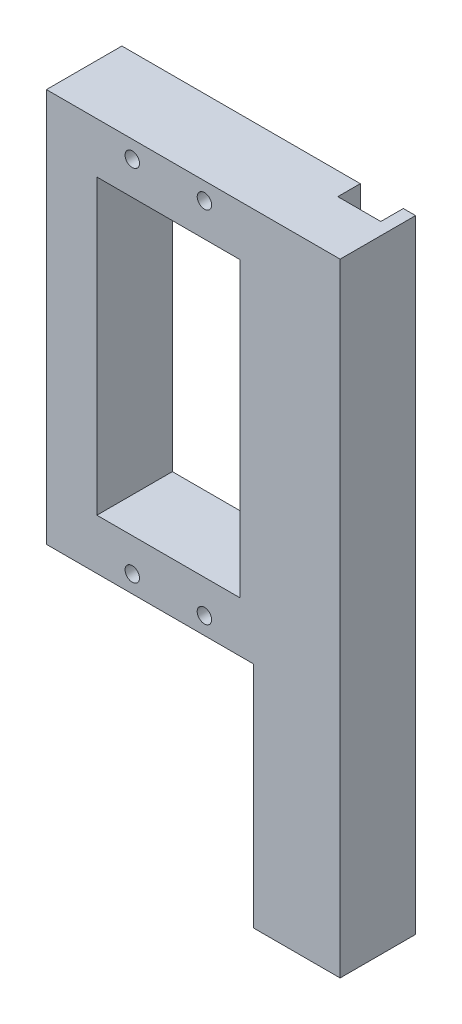
ISO-10303-21;
HEADER;
FILE_DESCRIPTION(('STEP AP214'),'2;1');
FILE_NAME('part.step','',(''),(''),'','','');
FILE_SCHEMA(('AUTOMOTIVE_DESIGN { 1 0 10303 214 1 1 1 1 }'));
ENDSEC;
DATA;
#1=APPLICATION_CONTEXT('core data for automotive mechanical design processes');
#2=APPLICATION_PROTOCOL_DEFINITION('international standard','automotive_design',2000,#1);
#3=PRODUCT_CONTEXT('',#1,'mechanical');
#4=PRODUCT('Part','Part','',(#3));
#5=PRODUCT_RELATED_PRODUCT_CATEGORY('part','',(#4));
#6=PRODUCT_DEFINITION_FORMATION('','',#4);
#7=PRODUCT_DEFINITION_CONTEXT('part definition',#1,'design');
#8=PRODUCT_DEFINITION('design','',#6,#7);
#9=PRODUCT_DEFINITION_SHAPE('','',#8);
#10=(LENGTH_UNIT() NAMED_UNIT(*) SI_UNIT(.MILLI.,.METRE.));
#11=(NAMED_UNIT(*) PLANE_ANGLE_UNIT() SI_UNIT($,.RADIAN.));
#12=(NAMED_UNIT(*) SI_UNIT($,.STERADIAN.) SOLID_ANGLE_UNIT());
#13=UNCERTAINTY_MEASURE_WITH_UNIT(LENGTH_MEASURE(1.E-05),#10,'distance_accuracy_value','');
#14=(GEOMETRIC_REPRESENTATION_CONTEXT(3) GLOBAL_UNCERTAINTY_ASSIGNED_CONTEXT((#13)) GLOBAL_UNIT_ASSIGNED_CONTEXT((#10,
#11,#12)) REPRESENTATION_CONTEXT('',''));
#15=CARTESIAN_POINT('',(0.,0.,0.));
#16=DIRECTION('',(0.,0.,1.));
#17=DIRECTION('',(1.,0.,0.));
#18=AXIS2_PLACEMENT_3D('',#15,#16,#17);
#19=CARTESIAN_POINT('',(0.,0.,-30.46));
#20=DIRECTION('',(0.,0.,-1.));
#21=DIRECTION('',(1.,0.,0.));
#22=AXIS2_PLACEMENT_3D('',#19,#20,#21);
#23=PLANE('',#22);
#24=CARTESIAN_POINT('',(5.,-24.9,-30.46));
#25=DIRECTION('',(0.,0.,1.));
#26=DIRECTION('',(1.,0.,0.));
#27=AXIS2_PLACEMENT_3D('',#24,#25,#26);
#28=CIRCLE('',#27,1.);
#29=CARTESIAN_POINT('',(6.,-24.9,-30.46));
#30=VERTEX_POINT('',#29);
#31=EDGE_CURVE('E253',#30,#30,#28,.T.);
#32=ORIENTED_EDGE('',*,*,#31,.T.);
#33=EDGE_LOOP('',(#32));
#34=FACE_BOUND('',#33,.T.);
#35=CARTESIAN_POINT('',(-5.,24.89,-30.46));
#36=DIRECTION('',(0.,0.,1.));
#37=DIRECTION('',(1.,0.,0.));
#38=AXIS2_PLACEMENT_3D('',#35,#36,#37);
#39=CIRCLE('',#38,1.);
#40=CARTESIAN_POINT('',(-4.,24.89,-30.46));
#41=VERTEX_POINT('',#40);
#42=EDGE_CURVE('E489',#41,#41,#39,.T.);
#43=ORIENTED_EDGE('',*,*,#42,.T.);
#44=EDGE_LOOP('',(#43));
#45=FACE_BOUND('',#44,.T.);
#46=CARTESIAN_POINT('',(5.,24.89,-30.46));
#47=DIRECTION('',(0.,0.,1.));
#48=DIRECTION('',(1.,0.,0.));
#49=AXIS2_PLACEMENT_3D('',#46,#47,#48);
#50=CIRCLE('',#49,1.);
#51=CARTESIAN_POINT('',(6.,24.89,-30.46));
#52=VERTEX_POINT('',#51);
#53=EDGE_CURVE('E492',#52,#52,#50,.T.);
#54=ORIENTED_EDGE('',*,*,#53,.T.);
#55=EDGE_LOOP('',(#54));
#56=FACE_BOUND('',#55,.T.);
#57=CARTESIAN_POINT('',(-5.,-24.9,-30.46));
#58=DIRECTION('',(0.,0.,1.));
#59=DIRECTION('',(1.,0.,0.));
#60=AXIS2_PLACEMENT_3D('',#57,#58,#59);
#61=CIRCLE('',#60,1.);
#62=CARTESIAN_POINT('',(-4.,-24.9,-30.46));
#63=VERTEX_POINT('',#62);
#64=EDGE_CURVE('E162',#63,#63,#61,.T.);
#65=ORIENTED_EDGE('',*,*,#64,.T.);
#66=EDGE_LOOP('',(#65));
#67=FACE_BOUND('',#66,.T.);
#68=DIRECTION('',(0.,-1.,0.));
#69=VECTOR('',#68,1.);
#70=CARTESIAN_POINT('',(16.1509101807035,27.3,-30.46));
#71=LINE('',#70,#69);
#72=CARTESIAN_POINT('',(16.1509101807035,27.3,-30.46));
#73=VERTEX_POINT('',#72);
#74=CARTESIAN_POINT('',(16.1509101807035,-59.0021499848978,-30.46));
#75=VERTEX_POINT('',#74);
#76=EDGE_CURVE('E159',#73,#75,#71,.T.);
#77=ORIENTED_EDGE('',*,*,#76,.T.);
#78=DIRECTION('',(1.,0.,0.));
#79=VECTOR('',#78,1.);
#80=CARTESIAN_POINT('',(11.8131026191315,-59.0021499848978,-30.46));
#81=LINE('',#80,#79);
#82=CARTESIAN_POINT('',(11.8131026191315,-59.0021499848978,-30.46));
#83=VERTEX_POINT('',#82);
#84=EDGE_CURVE('E151',#83,#75,#81,.T.);
#85=ORIENTED_EDGE('',*,*,#84,.F.);
#86=DIRECTION('',(0.,-1.,0.));
#87=VECTOR('',#86,1.);
#88=CARTESIAN_POINT('',(11.8131026191315,-27.3,-30.46));
#89=LINE('',#88,#87);
#90=CARTESIAN_POINT('',(11.8131026191315,-27.3,-30.46));
#91=VERTEX_POINT('',#90);
#92=EDGE_CURVE('E214',#91,#83,#89,.T.);
#93=ORIENTED_EDGE('',*,*,#92,.F.);
#94=DIRECTION('',(1.,0.,0.));
#95=VECTOR('',#94,1.);
#96=CARTESIAN_POINT('',(-2.175,-27.3,-30.46));
#97=LINE('',#96,#95);
#98=CARTESIAN_POINT('',(-16.9,-27.3,-30.46));
#99=VERTEX_POINT('',#98);
#100=EDGE_CURVE('E211',#99,#91,#97,.T.);
#101=ORIENTED_EDGE('',*,*,#100,.F.);
#102=DIRECTION('',(0.,-1.,0.));
#103=VECTOR('',#102,1.);
#104=CARTESIAN_POINT('',(-16.9,27.3,-30.46));
#105=LINE('',#104,#103);
#106=CARTESIAN_POINT('',(-16.9,27.3,-30.46));
#107=VERTEX_POINT('',#106);
#108=EDGE_CURVE('E207',#107,#99,#105,.T.);
#109=ORIENTED_EDGE('',*,*,#108,.F.);
#110=DIRECTION('',(-1.,0.,0.));
#111=VECTOR('',#110,1.);
#112=CARTESIAN_POINT('',(-7.90000000000001,27.3,-30.46));
#113=LINE('',#112,#111);
#114=EDGE_CURVE('E208',#73,#107,#113,.T.);
#115=ORIENTED_EDGE('',*,*,#114,.F.);
#116=EDGE_LOOP('',(#77,#85,#93,#101,#109,#115));
#117=FACE_BOUND('',#116,.T.);
#118=DIRECTION('',(1.,0.,0.));
#119=VECTOR('',#118,1.);
#120=CARTESIAN_POINT('',(-9.9,-20.3,-30.46));
#121=LINE('',#120,#119);
#122=CARTESIAN_POINT('',(-9.9,-20.3,-30.46));
#123=VERTEX_POINT('',#122);
#124=CARTESIAN_POINT('',(9.9,-20.3,-30.46));
#125=VERTEX_POINT('',#124);
#126=EDGE_CURVE('E177',#123,#125,#121,.T.);
#127=ORIENTED_EDGE('',*,*,#126,.T.);
#128=DIRECTION('',(0.,1.,0.));
#129=VECTOR('',#128,1.);
#130=CARTESIAN_POINT('',(9.9,-19.3,-30.46));
#131=LINE('',#130,#129);
#132=CARTESIAN_POINT('',(9.9,20.3,-30.46));
#133=VERTEX_POINT('',#132);
#134=EDGE_CURVE('E181',#125,#133,#131,.T.);
#135=ORIENTED_EDGE('',*,*,#134,.T.);
#136=DIRECTION('',(-1.,0.,0.));
#137=VECTOR('',#136,1.);
#138=CARTESIAN_POINT('',(9.9,20.3,-30.46));
#139=LINE('',#138,#137);
#140=CARTESIAN_POINT('',(-9.9,20.3,-30.46));
#141=VERTEX_POINT('',#140);
#142=EDGE_CURVE('E184',#133,#141,#139,.T.);
#143=ORIENTED_EDGE('',*,*,#142,.T.);
#144=DIRECTION('',(0.,-1.,0.));
#145=VECTOR('',#144,1.);
#146=CARTESIAN_POINT('',(-9.9,20.3,-30.46));
#147=LINE('',#146,#145);
#148=EDGE_CURVE('E174',#141,#123,#147,.T.);
#149=ORIENTED_EDGE('',*,*,#148,.T.);
#150=EDGE_LOOP('',(#127,#135,#143,#149));
#151=FACE_BOUND('',#150,.T.);
#152=ADVANCED_FACE('F32',(#34,#45,#56,#67,#117,#151),#23,.T.);
#153=DIRECTION('',(0.,1.,0.));
#154=VECTOR('',#153,1.);
#155=CARTESIAN_POINT('',(22.1131026191314,-59.0021499848978,-30.46));
#156=LINE('',#155,#154);
#157=CARTESIAN_POINT('',(22.1131026191314,-59.0021499848978,-30.46));
#158=VERTEX_POINT('',#157);
#159=CARTESIAN_POINT('',(22.1131026191314,27.3,-30.46));
#160=VERTEX_POINT('',#159);
#161=EDGE_CURVE('E156',#158,#160,#156,.T.);
#162=ORIENTED_EDGE('',*,*,#161,.T.);
#163=CARTESIAN_POINT('',(23.8131026191315,27.3,-30.46));
#164=VERTEX_POINT('',#163);
#165=EDGE_CURVE('E204',#164,#160,#113,.T.);
#166=ORIENTED_EDGE('',*,*,#165,.F.);
#167=DIRECTION('',(0.,1.,0.));
#168=VECTOR('',#167,1.);
#169=CARTESIAN_POINT('',(23.8131026191315,-59.0021499848978,-30.46));
#170=LINE('',#169,#168);
#171=CARTESIAN_POINT('',(23.8131026191315,-59.0021499848978,-30.46));
#172=VERTEX_POINT('',#171);
#173=EDGE_CURVE('E219',#172,#164,#170,.T.);
#174=ORIENTED_EDGE('',*,*,#173,.F.);
#175=EDGE_CURVE('E217',#158,#172,#81,.T.);
#176=ORIENTED_EDGE('',*,*,#175,.F.);
#177=EDGE_LOOP('',(#162,#166,#174,#176));
#178=FACE_BOUND('',#177,.T.);
#179=ADVANCED_FACE('F275',(#178),#23,.T.);
#180=CARTESIAN_POINT('',(0.,0.,-20.));
#181=DIRECTION('',(0.,0.,-1.));
#182=DIRECTION('',(1.,0.,0.));
#183=AXIS2_PLACEMENT_3D('',#180,#181,#182);
#184=PLANE('',#183);
#185=CARTESIAN_POINT('',(5.,-24.9,-20.));
#186=DIRECTION('',(0.,0.,1.));
#187=DIRECTION('',(1.,0.,0.));
#188=AXIS2_PLACEMENT_3D('',#185,#186,#187);
#189=CIRCLE('',#188,1.);
#190=CARTESIAN_POINT('',(6.,-24.9,-20.));
#191=VERTEX_POINT('',#190);
#192=EDGE_CURVE('E36',#191,#191,#189,.T.);
#193=ORIENTED_EDGE('',*,*,#192,.F.);
#194=EDGE_LOOP('',(#193));
#195=FACE_BOUND('',#194,.T.);
#196=CARTESIAN_POINT('',(-5.,24.89,-20.));
#197=DIRECTION('',(0.,0.,1.));
#198=DIRECTION('',(1.,0.,0.));
#199=AXIS2_PLACEMENT_3D('',#196,#197,#198);
#200=CIRCLE('',#199,1.);
#201=CARTESIAN_POINT('',(-4.,24.89,-20.));
#202=VERTEX_POINT('',#201);
#203=EDGE_CURVE('E252',#202,#202,#200,.T.);
#204=ORIENTED_EDGE('',*,*,#203,.F.);
#205=EDGE_LOOP('',(#204));
#206=FACE_BOUND('',#205,.T.);
#207=CARTESIAN_POINT('',(5.,24.89,-20.));
#208=DIRECTION('',(0.,0.,1.));
#209=DIRECTION('',(1.,0.,0.));
#210=AXIS2_PLACEMENT_3D('',#207,#208,#209);
#211=CIRCLE('',#210,1.);
#212=CARTESIAN_POINT('',(6.,24.89,-20.));
#213=VERTEX_POINT('',#212);
#214=EDGE_CURVE('E250',#213,#213,#211,.T.);
#215=ORIENTED_EDGE('',*,*,#214,.F.);
#216=EDGE_LOOP('',(#215));
#217=FACE_BOUND('',#216,.T.);
#218=CARTESIAN_POINT('',(-5.,-24.9,-20.));
#219=DIRECTION('',(0.,0.,1.));
#220=DIRECTION('',(1.,0.,0.));
#221=AXIS2_PLACEMENT_3D('',#218,#219,#220);
#222=CIRCLE('',#221,1.);
#223=CARTESIAN_POINT('',(-4.,-24.9,-20.));
#224=VERTEX_POINT('',#223);
#225=EDGE_CURVE('E168',#224,#224,#222,.T.);
#226=ORIENTED_EDGE('',*,*,#225,.F.);
#227=EDGE_LOOP('',(#226));
#228=FACE_BOUND('',#227,.T.);
#229=DIRECTION('',(0.,-1.,0.));
#230=VECTOR('',#229,1.);
#231=CARTESIAN_POINT('',(-16.9,27.3,-20.));
#232=LINE('',#231,#230);
#233=CARTESIAN_POINT('',(-16.9,27.3,-20.));
#234=VERTEX_POINT('',#233);
#235=CARTESIAN_POINT('',(-16.9,-27.3,-20.));
#236=VERTEX_POINT('',#235);
#237=EDGE_CURVE('E203',#234,#236,#232,.T.);
#238=ORIENTED_EDGE('',*,*,#237,.T.);
#239=DIRECTION('',(1.,0.,0.));
#240=VECTOR('',#239,1.);
#241=CARTESIAN_POINT('',(-2.175,-27.3,-20.));
#242=LINE('',#241,#240);
#243=CARTESIAN_POINT('',(11.8131026191315,-27.3,-20.));
#244=VERTEX_POINT('',#243);
#245=EDGE_CURVE('E225',#236,#244,#242,.T.);
#246=ORIENTED_EDGE('',*,*,#245,.T.);
#247=DIRECTION('',(0.,-1.,0.));
#248=VECTOR('',#247,1.);
#249=CARTESIAN_POINT('',(11.8131026191315,-27.3,-20.));
#250=LINE('',#249,#248);
#251=CARTESIAN_POINT('',(11.8131026191315,-59.0021499848978,-20.));
#252=VERTEX_POINT('',#251);
#253=EDGE_CURVE('E228',#244,#252,#250,.T.);
#254=ORIENTED_EDGE('',*,*,#253,.T.);
#255=DIRECTION('',(1.,0.,0.));
#256=VECTOR('',#255,1.);
#257=CARTESIAN_POINT('',(11.8131026191315,-59.0021499848978,-20.));
#258=LINE('',#257,#256);
#259=CARTESIAN_POINT('',(23.8131026191315,-59.0021499848978,-20.));
#260=VERTEX_POINT('',#259);
#261=EDGE_CURVE('E231',#252,#260,#258,.T.);
#262=ORIENTED_EDGE('',*,*,#261,.T.);
#263=DIRECTION('',(0.,1.,0.));
#264=VECTOR('',#263,1.);
#265=CARTESIAN_POINT('',(23.8131026191315,-59.0021499848978,-20.));
#266=LINE('',#265,#264);
#267=CARTESIAN_POINT('',(23.8131026191315,27.3,-20.));
#268=VERTEX_POINT('',#267);
#269=EDGE_CURVE('E234',#260,#268,#266,.T.);
#270=ORIENTED_EDGE('',*,*,#269,.T.);
#271=DIRECTION('',(-1.,0.,0.));
#272=VECTOR('',#271,1.);
#273=CARTESIAN_POINT('',(-7.90000000000001,27.3,-20.));
#274=LINE('',#273,#272);
#275=EDGE_CURVE('E237',#268,#234,#274,.T.);
#276=ORIENTED_EDGE('',*,*,#275,.T.);
#277=EDGE_LOOP('',(#238,#246,#254,#262,#270,#276));
#278=FACE_BOUND('',#277,.T.);
#279=DIRECTION('',(0.,-1.,0.));
#280=VECTOR('',#279,1.);
#281=CARTESIAN_POINT('',(-9.9,20.3,-20.));
#282=LINE('',#281,#280);
#283=CARTESIAN_POINT('',(-9.9,20.3,-20.));
#284=VERTEX_POINT('',#283);
#285=CARTESIAN_POINT('',(-9.9,-20.3,-20.));
#286=VERTEX_POINT('',#285);
#287=EDGE_CURVE('E153',#284,#286,#282,.T.);
#288=ORIENTED_EDGE('',*,*,#287,.F.);
#289=DIRECTION('',(-1.,0.,0.));
#290=VECTOR('',#289,1.);
#291=CARTESIAN_POINT('',(9.9,20.3,-20.));
#292=LINE('',#291,#290);
#293=CARTESIAN_POINT('',(9.9,20.3,-20.));
#294=VERTEX_POINT('',#293);
#295=EDGE_CURVE('E178',#294,#284,#292,.T.);
#296=ORIENTED_EDGE('',*,*,#295,.F.);
#297=DIRECTION('',(0.,1.,0.));
#298=VECTOR('',#297,1.);
#299=CARTESIAN_POINT('',(9.9,-19.3,-20.));
#300=LINE('',#299,#298);
#301=CARTESIAN_POINT('',(9.9,-20.3,-20.));
#302=VERTEX_POINT('',#301);
#303=EDGE_CURVE('E193',#302,#294,#300,.T.);
#304=ORIENTED_EDGE('',*,*,#303,.F.);
#305=DIRECTION('',(1.,0.,0.));
#306=VECTOR('',#305,1.);
#307=CARTESIAN_POINT('',(-9.9,-20.3,-20.));
#308=LINE('',#307,#306);
#309=EDGE_CURVE('E190',#286,#302,#308,.T.);
#310=ORIENTED_EDGE('',*,*,#309,.F.);
#311=EDGE_LOOP('',(#288,#296,#304,#310));
#312=FACE_BOUND('',#311,.T.);
#313=ADVANCED_FACE('F272',(#195,#206,#217,#228,#278,#312),#184,.F.);
#314=CARTESIAN_POINT('',(-16.9,27.3,-30.46));
#315=DIRECTION('',(1.,0.,0.));
#316=DIRECTION('',(0.,0.,1.));
#317=AXIS2_PLACEMENT_3D('',#314,#315,#316);
#318=PLANE('',#317);
#319=ORIENTED_EDGE('',*,*,#237,.F.);
#320=DIRECTION('',(0.,0.,1.));
#321=VECTOR('',#320,1.);
#322=CARTESIAN_POINT('',(-16.9,27.3,-30.46));
#323=LINE('',#322,#321);
#324=EDGE_CURVE('E11',#107,#234,#323,.T.);
#325=ORIENTED_EDGE('',*,*,#324,.F.);
#326=ORIENTED_EDGE('',*,*,#108,.T.);
#327=DIRECTION('',(0.,0.,1.));
#328=VECTOR('',#327,1.);
#329=CARTESIAN_POINT('',(-16.9,-27.3,-30.46));
#330=LINE('',#329,#328);
#331=EDGE_CURVE('E41',#99,#236,#330,.T.);
#332=ORIENTED_EDGE('',*,*,#331,.T.);
#333=EDGE_LOOP('',(#319,#325,#326,#332));
#334=FACE_BOUND('',#333,.T.);
#335=ADVANCED_FACE('F34',(#334),#318,.F.);
#336=CARTESIAN_POINT('',(-2.175,-27.3,-30.46));
#337=DIRECTION('',(0.,1.,0.));
#338=DIRECTION('',(0.,0.,-1.));
#339=AXIS2_PLACEMENT_3D('',#336,#337,#338);
#340=PLANE('',#339);
#341=ORIENTED_EDGE('',*,*,#245,.F.);
#342=ORIENTED_EDGE('',*,*,#331,.F.);
#343=ORIENTED_EDGE('',*,*,#100,.T.);
#344=DIRECTION('',(0.,0.,1.));
#345=VECTOR('',#344,1.);
#346=CARTESIAN_POINT('',(11.8131026191315,-27.3,-30.46));
#347=LINE('',#346,#345);
#348=EDGE_CURVE('E245',#91,#244,#347,.T.);
#349=ORIENTED_EDGE('',*,*,#348,.T.);
#350=EDGE_LOOP('',(#341,#342,#343,#349));
#351=FACE_BOUND('',#350,.T.);
#352=ADVANCED_FACE('F318',(#351),#340,.F.);
#353=CARTESIAN_POINT('',(11.8131026191315,-27.3,-30.46));
#354=DIRECTION('',(1.,0.,0.));
#355=DIRECTION('',(0.,0.,1.));
#356=AXIS2_PLACEMENT_3D('',#353,#354,#355);
#357=PLANE('',#356);
#358=ORIENTED_EDGE('',*,*,#253,.F.);
#359=ORIENTED_EDGE('',*,*,#348,.F.);
#360=ORIENTED_EDGE('',*,*,#92,.T.);
#361=DIRECTION('',(0.,0.,1.));
#362=VECTOR('',#361,1.);
#363=CARTESIAN_POINT('',(11.8131026191315,-59.0021499848978,-30.46));
#364=LINE('',#363,#362);
#365=EDGE_CURVE('E243',#83,#252,#364,.T.);
#366=ORIENTED_EDGE('',*,*,#365,.T.);
#367=EDGE_LOOP('',(#358,#359,#360,#366));
#368=FACE_BOUND('',#367,.T.);
#369=ADVANCED_FACE('F316',(#368),#357,.F.);
#370=CARTESIAN_POINT('',(11.8131026191315,-59.0021499848978,-30.46));
#371=DIRECTION('',(0.,1.,0.));
#372=DIRECTION('',(0.,0.,-1.));
#373=AXIS2_PLACEMENT_3D('',#370,#371,#372);
#374=PLANE('',#373);
#375=DIRECTION('',(-1.,0.,0.));
#376=VECTOR('',#375,1.);
#377=CARTESIAN_POINT('',(17.8131026191315,-59.0021499848978,-27.34));
#378=LINE('',#377,#376);
#379=CARTESIAN_POINT('',(22.1131026191314,-59.0021499848978,-27.34));
#380=VERTEX_POINT('',#379);
#381=CARTESIAN_POINT('',(16.1509101807035,-59.0021499848978,-27.34));
#382=VERTEX_POINT('',#381);
#383=EDGE_CURVE('E145',#380,#382,#378,.T.);
#384=ORIENTED_EDGE('',*,*,#383,.F.);
#385=DIRECTION('',(0.,0.,-1.));
#386=VECTOR('',#385,1.);
#387=CARTESIAN_POINT('',(22.1131026191314,-59.0021499848978,-27.34));
#388=LINE('',#387,#386);
#389=EDGE_CURVE('E167',#380,#158,#388,.T.);
#390=ORIENTED_EDGE('',*,*,#389,.T.);
#391=ORIENTED_EDGE('',*,*,#175,.T.);
#392=DIRECTION('',(0.,0.,1.));
#393=VECTOR('',#392,1.);
#394=CARTESIAN_POINT('',(23.8131026191315,-59.0021499848978,-30.46));
#395=LINE('',#394,#393);
#396=EDGE_CURVE('E241',#172,#260,#395,.T.);
#397=ORIENTED_EDGE('',*,*,#396,.T.);
#398=ORIENTED_EDGE('',*,*,#261,.F.);
#399=ORIENTED_EDGE('',*,*,#365,.F.);
#400=ORIENTED_EDGE('',*,*,#84,.T.);
#401=DIRECTION('',(0.,0.,-1.));
#402=VECTOR('',#401,1.);
#403=CARTESIAN_POINT('',(16.1509101807035,-59.0021499848978,-27.34));
#404=LINE('',#403,#402);
#405=EDGE_CURVE('E138',#382,#75,#404,.T.);
#406=ORIENTED_EDGE('',*,*,#405,.F.);
#407=EDGE_LOOP('',(#384,#390,#391,#397,#398,#399,#400,#406));
#408=FACE_BOUND('',#407,.T.);
#409=ADVANCED_FACE('F149',(#408),#374,.F.);
#410=CARTESIAN_POINT('',(23.8131026191315,-59.0021499848978,-30.46));
#411=DIRECTION('',(-1.,0.,0.));
#412=DIRECTION('',(0.,0.,-1.));
#413=AXIS2_PLACEMENT_3D('',#410,#411,#412);
#414=PLANE('',#413);
#415=ORIENTED_EDGE('',*,*,#269,.F.);
#416=ORIENTED_EDGE('',*,*,#396,.F.);
#417=ORIENTED_EDGE('',*,*,#173,.T.);
#418=DIRECTION('',(0.,0.,1.));
#419=VECTOR('',#418,1.);
#420=CARTESIAN_POINT('',(23.8131026191315,27.3,-30.46));
#421=LINE('',#420,#419);
#422=EDGE_CURVE('E222',#164,#268,#421,.T.);
#423=ORIENTED_EDGE('',*,*,#422,.T.);
#424=EDGE_LOOP('',(#415,#416,#417,#423));
#425=FACE_BOUND('',#424,.T.);
#426=ADVANCED_FACE('F309',(#425),#414,.F.);
#427=CARTESIAN_POINT('',(-7.90000000000001,27.3,-30.46));
#428=DIRECTION('',(0.,-1.,0.));
#429=DIRECTION('',(1.,0.,0.));
#430=AXIS2_PLACEMENT_3D('',#427,#428,#429);
#431=PLANE('',#430);
#432=ORIENTED_EDGE('',*,*,#114,.T.);
#433=ORIENTED_EDGE('',*,*,#324,.T.);
#434=ORIENTED_EDGE('',*,*,#275,.F.);
#435=ORIENTED_EDGE('',*,*,#422,.F.);
#436=ORIENTED_EDGE('',*,*,#165,.T.);
#437=DIRECTION('',(0.,0.,-1.));
#438=VECTOR('',#437,1.);
#439=CARTESIAN_POINT('',(22.1131026191314,27.3,-27.34));
#440=LINE('',#439,#438);
#441=CARTESIAN_POINT('',(22.1131026191314,27.3,-27.34));
#442=VERTEX_POINT('',#441);
#443=EDGE_CURVE('E171',#442,#160,#440,.T.);
#444=ORIENTED_EDGE('',*,*,#443,.F.);
#445=DIRECTION('',(-1.,0.,0.));
#446=VECTOR('',#445,1.);
#447=CARTESIAN_POINT('',(17.2,27.3,-27.34));
#448=LINE('',#447,#446);
#449=CARTESIAN_POINT('',(16.1509101807035,27.3,-27.34));
#450=VERTEX_POINT('',#449);
#451=EDGE_CURVE('E144',#442,#450,#448,.T.);
#452=ORIENTED_EDGE('',*,*,#451,.T.);
#453=DIRECTION('',(0.,0.,-1.));
#454=VECTOR('',#453,1.);
#455=CARTESIAN_POINT('',(16.1509101807035,27.3,-27.34));
#456=LINE('',#455,#454);
#457=EDGE_CURVE('E140',#450,#73,#456,.T.);
#458=ORIENTED_EDGE('',*,*,#457,.T.);
#459=EDGE_LOOP('',(#432,#433,#434,#435,#436,#444,#452,#458));
#460=FACE_BOUND('',#459,.T.);
#461=ADVANCED_FACE('F306',(#460),#431,.F.);
#462=CARTESIAN_POINT('',(-9.9,20.3,-30.46));
#463=DIRECTION('',(1.,0.,0.));
#464=DIRECTION('',(0.,0.,1.));
#465=AXIS2_PLACEMENT_3D('',#462,#463,#464);
#466=PLANE('',#465);
#467=ORIENTED_EDGE('',*,*,#287,.T.);
#468=DIRECTION('',(0.,0.,1.));
#469=VECTOR('',#468,1.);
#470=CARTESIAN_POINT('',(-9.9,-20.3,-30.46));
#471=LINE('',#470,#469);
#472=EDGE_CURVE('E201',#123,#286,#471,.T.);
#473=ORIENTED_EDGE('',*,*,#472,.F.);
#474=ORIENTED_EDGE('',*,*,#148,.F.);
#475=DIRECTION('',(0.,0.,1.));
#476=VECTOR('',#475,1.);
#477=CARTESIAN_POINT('',(-9.9,20.3,-30.46));
#478=LINE('',#477,#476);
#479=EDGE_CURVE('E187',#141,#284,#478,.T.);
#480=ORIENTED_EDGE('',*,*,#479,.T.);
#481=EDGE_LOOP('',(#467,#473,#474,#480));
#482=FACE_BOUND('',#481,.T.);
#483=ADVANCED_FACE('F285',(#482),#466,.T.);
#484=CARTESIAN_POINT('',(-9.9,-20.3,-30.46));
#485=DIRECTION('',(0.,1.,0.));
#486=DIRECTION('',(0.,0.,-1.));
#487=AXIS2_PLACEMENT_3D('',#484,#485,#486);
#488=PLANE('',#487);
#489=ORIENTED_EDGE('',*,*,#309,.T.);
#490=DIRECTION('',(0.,0.,1.));
#491=VECTOR('',#490,1.);
#492=CARTESIAN_POINT('',(9.9,-20.3,-30.46));
#493=LINE('',#492,#491);
#494=EDGE_CURVE('E199',#125,#302,#493,.T.);
#495=ORIENTED_EDGE('',*,*,#494,.F.);
#496=ORIENTED_EDGE('',*,*,#126,.F.);
#497=ORIENTED_EDGE('',*,*,#472,.T.);
#498=EDGE_LOOP('',(#489,#495,#496,#497));
#499=FACE_BOUND('',#498,.T.);
#500=ADVANCED_FACE('F292',(#499),#488,.T.);
#501=CARTESIAN_POINT('',(9.9,-19.3,-30.46));
#502=DIRECTION('',(-1.,0.,0.));
#503=DIRECTION('',(0.,0.,-1.));
#504=AXIS2_PLACEMENT_3D('',#501,#502,#503);
#505=PLANE('',#504);
#506=ORIENTED_EDGE('',*,*,#303,.T.);
#507=DIRECTION('',(0.,0.,1.));
#508=VECTOR('',#507,1.);
#509=CARTESIAN_POINT('',(9.9,20.3,-30.46));
#510=LINE('',#509,#508);
#511=EDGE_CURVE('E57',#133,#294,#510,.T.);
#512=ORIENTED_EDGE('',*,*,#511,.F.);
#513=ORIENTED_EDGE('',*,*,#134,.F.);
#514=ORIENTED_EDGE('',*,*,#494,.T.);
#515=EDGE_LOOP('',(#506,#512,#513,#514));
#516=FACE_BOUND('',#515,.T.);
#517=ADVANCED_FACE('F289',(#516),#505,.T.);
#518=CARTESIAN_POINT('',(9.9,20.3,-30.46));
#519=DIRECTION('',(0.,-1.,0.));
#520=DIRECTION('',(0.,0.,1.));
#521=AXIS2_PLACEMENT_3D('',#518,#519,#520);
#522=PLANE('',#521);
#523=ORIENTED_EDGE('',*,*,#295,.T.);
#524=ORIENTED_EDGE('',*,*,#479,.F.);
#525=ORIENTED_EDGE('',*,*,#142,.F.);
#526=ORIENTED_EDGE('',*,*,#511,.T.);
#527=EDGE_LOOP('',(#523,#524,#525,#526));
#528=FACE_BOUND('',#527,.T.);
#529=ADVANCED_FACE('F288',(#528),#522,.T.);
#530=CARTESIAN_POINT('',(16.1509101807035,27.3,-27.34));
#531=DIRECTION('',(-1.,0.,0.));
#532=DIRECTION('',(0.,0.,-1.));
#533=AXIS2_PLACEMENT_3D('',#530,#531,#532);
#534=PLANE('',#533);
#535=ORIENTED_EDGE('',*,*,#76,.F.);
#536=ORIENTED_EDGE('',*,*,#457,.F.);
#537=DIRECTION('',(0.,-1.,0.));
#538=VECTOR('',#537,1.);
#539=CARTESIAN_POINT('',(16.1509101807035,27.3,-27.34));
#540=LINE('',#539,#538);
#541=EDGE_CURVE('E134',#450,#382,#540,.T.);
#542=ORIENTED_EDGE('',*,*,#541,.T.);
#543=ORIENTED_EDGE('',*,*,#405,.T.);
#544=EDGE_LOOP('',(#535,#536,#542,#543));
#545=FACE_BOUND('',#544,.T.);
#546=ADVANCED_FACE('F137',(#545),#534,.F.);
#547=CARTESIAN_POINT('',(22.1131026191314,-59.0021499848978,-27.34));
#548=DIRECTION('',(1.,0.,0.));
#549=DIRECTION('',(0.,0.,1.));
#550=AXIS2_PLACEMENT_3D('',#547,#548,#549);
#551=PLANE('',#550);
#552=ORIENTED_EDGE('',*,*,#161,.F.);
#553=ORIENTED_EDGE('',*,*,#389,.F.);
#554=DIRECTION('',(0.,1.,0.));
#555=VECTOR('',#554,1.);
#556=CARTESIAN_POINT('',(22.1131026191314,-59.0021499848978,-27.34));
#557=LINE('',#556,#555);
#558=EDGE_CURVE('E49',#380,#442,#557,.T.);
#559=ORIENTED_EDGE('',*,*,#558,.T.);
#560=ORIENTED_EDGE('',*,*,#443,.T.);
#561=EDGE_LOOP('',(#552,#553,#559,#560));
#562=FACE_BOUND('',#561,.T.);
#563=ADVANCED_FACE('F342',(#562),#551,.F.);
#564=CARTESIAN_POINT('',(0.,0.,-27.34));
#565=DIRECTION('',(0.,0.,-1.));
#566=DIRECTION('',(1.,0.,0.));
#567=AXIS2_PLACEMENT_3D('',#564,#565,#566);
#568=PLANE('',#567);
#569=ORIENTED_EDGE('',*,*,#383,.T.);
#570=ORIENTED_EDGE('',*,*,#541,.F.);
#571=ORIENTED_EDGE('',*,*,#451,.F.);
#572=ORIENTED_EDGE('',*,*,#558,.F.);
#573=EDGE_LOOP('',(#569,#570,#571,#572));
#574=FACE_BOUND('',#573,.T.);
#575=ADVANCED_FACE('F155',(#574),#568,.T.);
#576=CARTESIAN_POINT('',(-5.,-24.9,-10.46));
#577=DIRECTION('',(0.,0.,-1.));
#578=DIRECTION('',(1.,0.,0.));
#579=AXIS2_PLACEMENT_3D('',#576,#577,#578);
#580=CYLINDRICAL_SURFACE('',#579,1.);
#581=ORIENTED_EDGE('',*,*,#64,.F.);
#582=EDGE_LOOP('',(#581));
#583=FACE_BOUND('',#582,.T.);
#584=ORIENTED_EDGE('',*,*,#225,.T.);
#585=EDGE_LOOP('',(#584));
#586=FACE_BOUND('',#585,.T.);
#587=ADVANCED_FACE('F265',(#583,#586),#580,.F.);
#588=CARTESIAN_POINT('',(5.,24.89,-10.46));
#589=DIRECTION('',(0.,0.,-1.));
#590=DIRECTION('',(1.,0.,0.));
#591=AXIS2_PLACEMENT_3D('',#588,#589,#590);
#592=CYLINDRICAL_SURFACE('',#591,1.);
#593=ORIENTED_EDGE('',*,*,#53,.F.);
#594=EDGE_LOOP('',(#593));
#595=FACE_BOUND('',#594,.T.);
#596=ORIENTED_EDGE('',*,*,#214,.T.);
#597=EDGE_LOOP('',(#596));
#598=FACE_BOUND('',#597,.T.);
#599=ADVANCED_FACE('F268',(#595,#598),#592,.F.);
#600=CARTESIAN_POINT('',(-5.,24.89,-10.46));
#601=DIRECTION('',(0.,0.,-1.));
#602=DIRECTION('',(1.,0.,0.));
#603=AXIS2_PLACEMENT_3D('',#600,#601,#602);
#604=CYLINDRICAL_SURFACE('',#603,1.);
#605=ORIENTED_EDGE('',*,*,#42,.F.);
#606=EDGE_LOOP('',(#605));
#607=FACE_BOUND('',#606,.T.);
#608=ORIENTED_EDGE('',*,*,#203,.T.);
#609=EDGE_LOOP('',(#608));
#610=FACE_BOUND('',#609,.T.);
#611=ADVANCED_FACE('F463',(#607,#610),#604,.F.);
#612=CARTESIAN_POINT('',(5.,-24.9,-10.46));
#613=DIRECTION('',(0.,0.,-1.));
#614=DIRECTION('',(1.,0.,0.));
#615=AXIS2_PLACEMENT_3D('',#612,#613,#614);
#616=CYLINDRICAL_SURFACE('',#615,1.);
#617=ORIENTED_EDGE('',*,*,#31,.F.);
#618=EDGE_LOOP('',(#617));
#619=FACE_BOUND('',#618,.T.);
#620=ORIENTED_EDGE('',*,*,#192,.T.);
#621=EDGE_LOOP('',(#620));
#622=FACE_BOUND('',#621,.T.);
#623=ADVANCED_FACE('F472',(#619,#622),#616,.F.);
#624=CLOSED_SHELL('',(#152,#179,#313,#335,#352,#369,#409,#426,#461,#483,#500,#517,#529,#546,
#563,#575,#587,#599,#611,#623));
#625=MANIFOLD_SOLID_BREP('B2',#624);
#626=ADVANCED_BREP_SHAPE_REPRESENTATION('',(#18,#625),#14);
#627=SHAPE_DEFINITION_REPRESENTATION(#9,#626);
ENDSEC;
END-ISO-10303-21;
